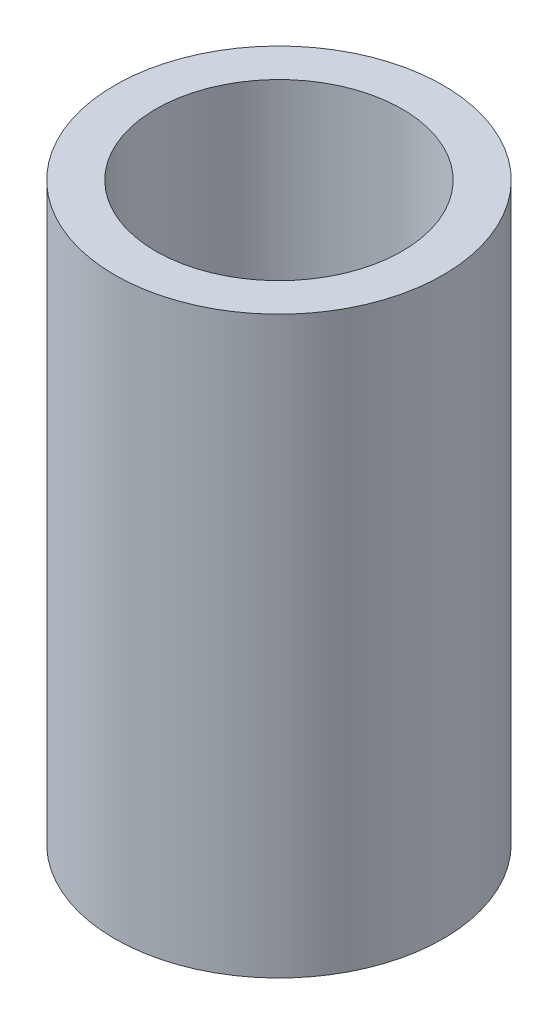
ISO-10303-21;
HEADER;
FILE_DESCRIPTION(('STEP AP214'),'2;1');
FILE_NAME('part.step','',(''),(''),'','','');
FILE_SCHEMA(('AUTOMOTIVE_DESIGN { 1 0 10303 214 1 1 1 1 }'));
ENDSEC;
DATA;
#1=APPLICATION_CONTEXT('core data for automotive mechanical design processes');
#2=APPLICATION_PROTOCOL_DEFINITION('international standard','automotive_design',2000,#1);
#3=PRODUCT_CONTEXT('',#1,'mechanical');
#4=PRODUCT('Part','Part','',(#3));
#5=PRODUCT_RELATED_PRODUCT_CATEGORY('part','',(#4));
#6=PRODUCT_DEFINITION_FORMATION('','',#4);
#7=PRODUCT_DEFINITION_CONTEXT('part definition',#1,'design');
#8=PRODUCT_DEFINITION('design','',#6,#7);
#9=PRODUCT_DEFINITION_SHAPE('','',#8);
#10=(LENGTH_UNIT() NAMED_UNIT(*) SI_UNIT(.MILLI.,.METRE.));
#11=(NAMED_UNIT(*) PLANE_ANGLE_UNIT() SI_UNIT($,.RADIAN.));
#12=(NAMED_UNIT(*) SI_UNIT($,.STERADIAN.) SOLID_ANGLE_UNIT());
#13=UNCERTAINTY_MEASURE_WITH_UNIT(LENGTH_MEASURE(1.E-05),#10,'distance_accuracy_value','');
#14=(GEOMETRIC_REPRESENTATION_CONTEXT(3) GLOBAL_UNCERTAINTY_ASSIGNED_CONTEXT((#13)) GLOBAL_UNIT_ASSIGNED_CONTEXT((#10,
#11,#12)) REPRESENTATION_CONTEXT('',''));
#15=CARTESIAN_POINT('',(0.,0.,0.));
#16=DIRECTION('',(0.,0.,1.));
#17=DIRECTION('',(1.,0.,0.));
#18=AXIS2_PLACEMENT_3D('',#15,#16,#17);
#19=CARTESIAN_POINT('',(0.,14.,0.));
#20=DIRECTION('',(0.,1.,0.));
#21=DIRECTION('',(0.,0.,1.));
#22=AXIS2_PLACEMENT_3D('',#19,#20,#21);
#23=PLANE('',#22);
#24=CARTESIAN_POINT('',(0.,14.,0.));
#25=DIRECTION('',(0.,1.,0.));
#26=DIRECTION('',(0.,0.,1.));
#27=AXIS2_PLACEMENT_3D('',#24,#25,#26);
#28=CIRCLE('',#27,8.);
#29=CARTESIAN_POINT('',(0.,14.,8.));
#30=VERTEX_POINT('',#29);
#31=EDGE_CURVE('E10',#30,#30,#28,.T.);
#32=ORIENTED_EDGE('',*,*,#31,.T.);
#33=EDGE_LOOP('',(#32));
#34=FACE_BOUND('',#33,.T.);
#35=CARTESIAN_POINT('',(0.,14.,0.));
#36=DIRECTION('',(0.,1.,0.));
#37=DIRECTION('',(0.,0.,1.));
#38=AXIS2_PLACEMENT_3D('',#35,#36,#37);
#39=CIRCLE('',#38,6.);
#40=CARTESIAN_POINT('',(0.,14.,6.));
#41=VERTEX_POINT('',#40);
#42=EDGE_CURVE('E41',#41,#41,#39,.T.);
#43=ORIENTED_EDGE('',*,*,#42,.F.);
#44=EDGE_LOOP('',(#43));
#45=FACE_BOUND('',#44,.T.);
#46=ADVANCED_FACE('F30',(#34,#45),#23,.T.);
#47=CARTESIAN_POINT('',(0.,-14.,0.));
#48=DIRECTION('',(0.,1.,0.));
#49=DIRECTION('',(0.,0.,1.));
#50=AXIS2_PLACEMENT_3D('',#47,#48,#49);
#51=PLANE('',#50);
#52=CARTESIAN_POINT('',(0.,-14.,0.));
#53=DIRECTION('',(0.,1.,0.));
#54=DIRECTION('',(0.,0.,1.));
#55=AXIS2_PLACEMENT_3D('',#52,#53,#54);
#56=CIRCLE('',#55,8.);
#57=CARTESIAN_POINT('',(0.,-14.,8.));
#58=VERTEX_POINT('',#57);
#59=EDGE_CURVE('E34',#58,#58,#56,.T.);
#60=ORIENTED_EDGE('',*,*,#59,.F.);
#61=EDGE_LOOP('',(#60));
#62=FACE_BOUND('',#61,.T.);
#63=CARTESIAN_POINT('',(0.,-14.,0.));
#64=DIRECTION('',(0.,1.,0.));
#65=DIRECTION('',(0.,0.,1.));
#66=AXIS2_PLACEMENT_3D('',#63,#64,#65);
#67=CIRCLE('',#66,6.);
#68=CARTESIAN_POINT('',(0.,-14.,6.));
#69=VERTEX_POINT('',#68);
#70=EDGE_CURVE('E43',#69,#69,#67,.T.);
#71=ORIENTED_EDGE('',*,*,#70,.T.);
#72=EDGE_LOOP('',(#71));
#73=FACE_BOUND('',#72,.T.);
#74=ADVANCED_FACE('F53',(#62,#73),#51,.F.);
#75=CARTESIAN_POINT('',(0.,14.,0.));
#76=DIRECTION('',(0.,-1.,0.));
#77=DIRECTION('',(0.,0.,-1.));
#78=AXIS2_PLACEMENT_3D('',#75,#76,#77);
#79=CYLINDRICAL_SURFACE('',#78,8.);
#80=ORIENTED_EDGE('',*,*,#31,.F.);
#81=EDGE_LOOP('',(#80));
#82=FACE_BOUND('',#81,.T.);
#83=ORIENTED_EDGE('',*,*,#59,.T.);
#84=EDGE_LOOP('',(#83));
#85=FACE_BOUND('',#84,.T.);
#86=ADVANCED_FACE('F32',(#82,#85),#79,.T.);
#87=CARTESIAN_POINT('',(0.,14.,0.));
#88=DIRECTION('',(0.,-1.,0.));
#89=DIRECTION('',(0.,0.,-1.));
#90=AXIS2_PLACEMENT_3D('',#87,#88,#89);
#91=CYLINDRICAL_SURFACE('',#90,6.);
#92=ORIENTED_EDGE('',*,*,#42,.T.);
#93=EDGE_LOOP('',(#92));
#94=FACE_BOUND('',#93,.T.);
#95=ORIENTED_EDGE('',*,*,#70,.F.);
#96=EDGE_LOOP('',(#95));
#97=FACE_BOUND('',#96,.T.);
#98=ADVANCED_FACE('F49',(#94,#97),#91,.F.);
#99=CLOSED_SHELL('',(#46,#74,#86,#98));
#100=MANIFOLD_SOLID_BREP('B2',#99);
#101=ADVANCED_BREP_SHAPE_REPRESENTATION('',(#18,#100),#14);
#102=SHAPE_DEFINITION_REPRESENTATION(#9,#101);
ENDSEC;
END-ISO-10303-21;
